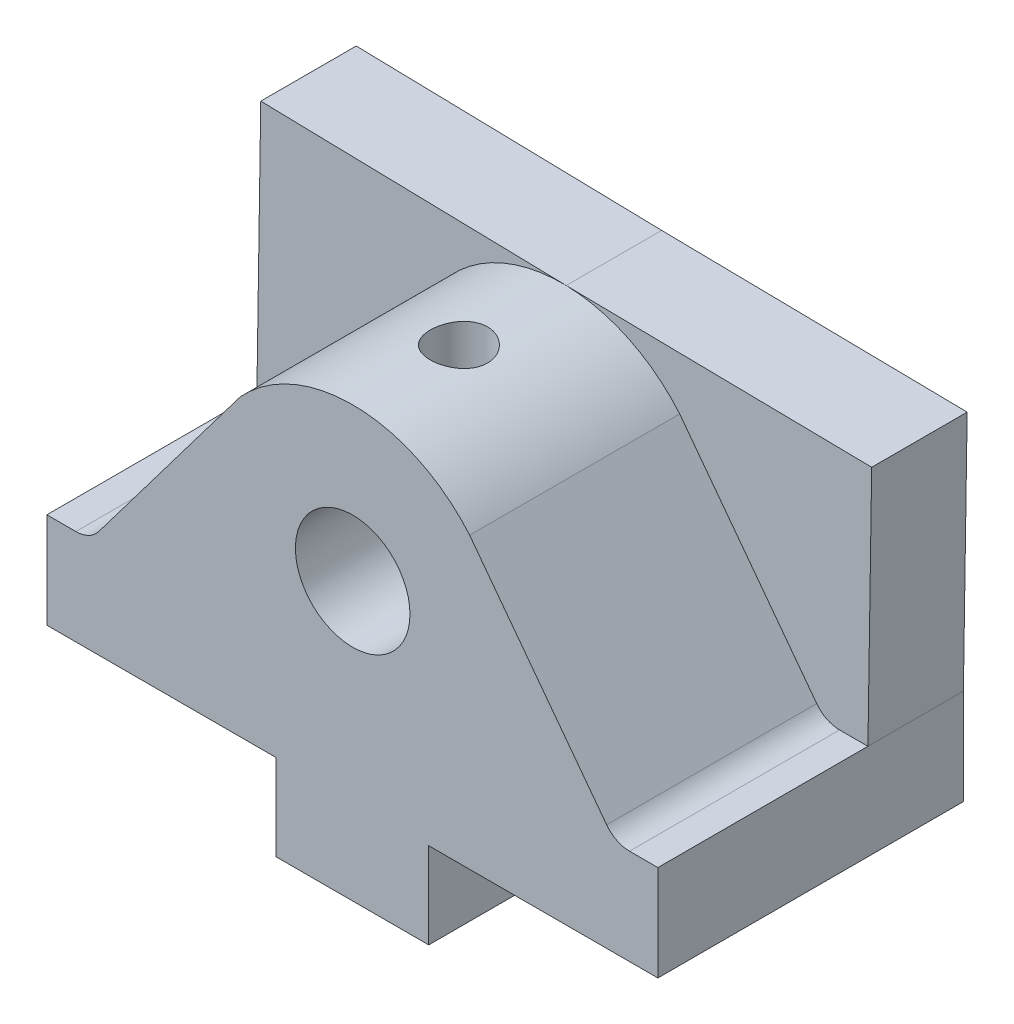
ISO-10303-21;
HEADER;
FILE_DESCRIPTION(('STEP AP214'),'2;1');
FILE_NAME('part.step','',(''),(''),'','','');
FILE_SCHEMA(('AUTOMOTIVE_DESIGN { 1 0 10303 214 1 1 1 1 }'));
ENDSEC;
DATA;
#1=APPLICATION_CONTEXT('core data for automotive mechanical design processes');
#2=APPLICATION_PROTOCOL_DEFINITION('international standard','automotive_design',2000,#1);
#3=PRODUCT_CONTEXT('',#1,'mechanical');
#4=PRODUCT('Part','Part','',(#3));
#5=PRODUCT_RELATED_PRODUCT_CATEGORY('part','',(#4));
#6=PRODUCT_DEFINITION_FORMATION('','',#4);
#7=PRODUCT_DEFINITION_CONTEXT('part definition',#1,'design');
#8=PRODUCT_DEFINITION('design','',#6,#7);
#9=PRODUCT_DEFINITION_SHAPE('','',#8);
#10=(LENGTH_UNIT() NAMED_UNIT(*) SI_UNIT(.MILLI.,.METRE.));
#11=(NAMED_UNIT(*) PLANE_ANGLE_UNIT() SI_UNIT($,.RADIAN.));
#12=(NAMED_UNIT(*) SI_UNIT($,.STERADIAN.) SOLID_ANGLE_UNIT());
#13=UNCERTAINTY_MEASURE_WITH_UNIT(LENGTH_MEASURE(1.E-05),#10,'distance_accuracy_value','');
#14=(GEOMETRIC_REPRESENTATION_CONTEXT(3) GLOBAL_UNCERTAINTY_ASSIGNED_CONTEXT((#13)) GLOBAL_UNIT_ASSIGNED_CONTEXT((#10,
#11,#12)) REPRESENTATION_CONTEXT('',''));
#15=CARTESIAN_POINT('',(0.,0.,0.));
#16=DIRECTION('',(0.,0.,1.));
#17=DIRECTION('',(1.,0.,0.));
#18=AXIS2_PLACEMENT_3D('',#15,#16,#17);
#19=CARTESIAN_POINT('',(0.,0.,-22.));
#20=DIRECTION('',(0.,0.,1.));
#21=DIRECTION('',(1.,0.,0.));
#22=AXIS2_PLACEMENT_3D('',#19,#20,#21);
#23=CYLINDRICAL_SURFACE('',#22,16.);
#24=CARTESIAN_POINT('',(0.,0.,0.));
#25=DIRECTION('',(0.,0.,1.));
#26=DIRECTION('',(1.,0.,0.));
#27=AXIS2_PLACEMENT_3D('',#24,#25,#26);
#28=CIRCLE('',#27,16.);
#29=CARTESIAN_POINT('',(12.2505989064215,10.2918815788943,0.));
#30=VERTEX_POINT('',#29);
#31=CARTESIAN_POINT('',(-11.7685318517286,10.8398181744368,0.));
#32=VERTEX_POINT('',#31);
#33=EDGE_CURVE('E110',#30,#32,#28,.T.);
#34=ORIENTED_EDGE('',*,*,#33,.F.);
#35=DIRECTION('',(0.,0.,1.));
#36=VECTOR('',#35,1.);
#37=CARTESIAN_POINT('',(12.2505989064215,10.2918815788943,-22.));
#38=LINE('',#37,#36);
#39=CARTESIAN_POINT('',(12.2505989064215,10.2918815788943,-22.));
#40=VERTEX_POINT('',#39);
#41=EDGE_CURVE('E118',#40,#30,#38,.T.);
#42=ORIENTED_EDGE('',*,*,#41,.F.);
#43=CARTESIAN_POINT('',(0.,0.,-22.));
#44=DIRECTION('',(0.,0.,1.));
#45=DIRECTION('',(1.,0.,0.));
#46=AXIS2_PLACEMENT_3D('',#43,#44,#45);
#47=CIRCLE('',#46,16.);
#48=CARTESIAN_POINT('',(0.364905178763938,15.9958383403469,-22.));
#49=VERTEX_POINT('',#48);
#50=EDGE_CURVE('E171',#40,#49,#47,.T.);
#51=ORIENTED_EDGE('',*,*,#50,.T.);
#52=CARTESIAN_POINT('',(-11.7685318517286,10.8398181744368,-22.));
#53=VERTEX_POINT('',#52);
#54=EDGE_CURVE('E115',#49,#53,#47,.T.);
#55=ORIENTED_EDGE('',*,*,#54,.T.);
#56=DIRECTION('',(0.,0.,1.));
#57=VECTOR('',#56,1.);
#58=CARTESIAN_POINT('',(-11.7685318517286,10.8398181744368,-22.));
#59=LINE('',#58,#57);
#60=EDGE_CURVE('E50',#53,#32,#59,.T.);
#61=ORIENTED_EDGE('',*,*,#60,.T.);
#62=EDGE_LOOP('',(#34,#42,#51,#55,#61));
#63=FACE_BOUND('',#62,.T.);
#64=CARTESIAN_POINT('',(0.,16.,-14.1252231760707));
#65=CARTESIAN_POINT('',(0.166943492930942,15.999996976677,-14.1252167968941));
#66=CARTESIAN_POINT('',(0.333969985460197,15.9973601984343,-14.1112410228319));
#67=CARTESIAN_POINT('',(0.663316259683595,15.9870957178104,-14.055743185834));
#68=CARTESIAN_POINT('',(0.825631948304451,15.9794638033379,-14.0141978747912));
#69=CARTESIAN_POINT('',(1.1407459237036,15.9600627753092,-13.904877773552));
#70=CARTESIAN_POINT('',(1.29355266137069,15.9482973989297,-13.8371266711656));
#71=CARTESIAN_POINT('',(1.58561594618801,15.9219142119957,-13.677385422225));
#72=CARTESIAN_POINT('',(1.72487358895464,15.9072966323658,-13.585397237781));
#73=CARTESIAN_POINT('',(1.987567431861,15.8766267286101,-13.3786236400633));
#74=CARTESIAN_POINT('',(2.11081791006366,15.860560697127,-13.2636042867304));
#75=CARTESIAN_POINT('',(2.33639212270738,15.828906369173,-13.0145365578956));
#76=CARTESIAN_POINT('',(2.43871435378483,15.8133181070905,-12.8804868165321));
#77=CARTESIAN_POINT('',(2.62029997331586,15.7842510249001,-12.5958509993427));
#78=CARTESIAN_POINT('',(2.6993744393921,15.7707898777236,-12.4451424354362));
#79=CARTESIAN_POINT('',(2.83101048664566,15.7476942642397,-12.1322853457171));
#80=CARTESIAN_POINT('',(2.88357435426196,15.7380594679392,-11.9701378078482));
#81=CARTESIAN_POINT('',(2.96010107007,15.723845391491,-11.6409927142419));
#82=CARTESIAN_POINT('',(2.98438780384078,15.7192089073281,-11.4740729816638));
#83=CARTESIAN_POINT('',(3.00467616190693,15.7153439430552,-11.1384684064542));
#84=CARTESIAN_POINT('',(3.00068032270748,15.7161149779752,-10.9697837234661));
#85=CARTESIAN_POINT('',(2.96477959204725,15.7229258540351,-10.6377841255386));
#86=CARTESIAN_POINT('',(2.9332429999209,15.7288961629467,-10.4744277474704));
#87=CARTESIAN_POINT('',(2.84373598792414,15.7453236656933,-10.1553663365055));
#88=CARTESIAN_POINT('',(2.78576444478999,15.7557810501903,-9.99966162905208));
#89=CARTESIAN_POINT('',(2.644672943586,15.7800771058518,-9.69924581807015));
#90=CARTESIAN_POINT('',(2.56140427064912,15.7939356764673,-9.55460623490906));
#91=CARTESIAN_POINT('',(2.37218737860832,15.8234594320584,-9.28121371899021));
#92=CARTESIAN_POINT('',(2.26623685778532,15.8391248003104,-9.15246240064108));
#93=CARTESIAN_POINT('',(2.03267811370595,15.8708000254433,-8.91237326472576));
#94=CARTESIAN_POINT('',(1.90475487372136,15.8868114204806,-8.80134187116719));
#95=CARTESIAN_POINT('',(1.63193607419765,15.9171477221664,-8.60226869471987));
#96=CARTESIAN_POINT('',(1.48704034451154,15.9314726119049,-8.51422714232984));
#97=CARTESIAN_POINT('',(1.18406997774934,15.9568507935502,-8.36358766833064));
#98=CARTESIAN_POINT('',(1.02597912889299,15.9678999827258,-8.30102161783489));
#99=CARTESIAN_POINT('',(0.701278230797394,15.9854501080544,-8.20341898988636));
#100=CARTESIAN_POINT('',(0.534669088555574,15.9919515273599,-8.16837948797997));
#101=CARTESIAN_POINT('',(0.20029730580677,15.9996072128396,-8.12725111403414));
#102=CARTESIAN_POINT('',(0.03258802526827,16.0008390182456,-8.12074239301123));
#103=CARTESIAN_POINT('',(-0.301522496184368,15.9980308719646,-8.13573413516598));
#104=CARTESIAN_POINT('',(-0.467923800960771,15.9939911792886,-8.1572332222012));
#105=CARTESIAN_POINT('',(-0.793363146436434,15.9811422300081,-8.22728124643741));
#106=CARTESIAN_POINT('',(-0.952448522092127,15.9723704474806,-8.27561774114631));
#107=CARTESIAN_POINT('',(-1.26025726364927,15.95103684425,-8.39773858962825));
#108=CARTESIAN_POINT('',(-1.40897992519021,15.9384747662267,-8.47152467120225));
#109=CARTESIAN_POINT('',(-1.69363334302643,15.9107606071533,-8.6433794323897));
#110=CARTESIAN_POINT('',(-1.82940655403024,15.8955817234913,-8.74170465314436));
#111=CARTESIAN_POINT('',(-2.08267664652909,15.8643868697942,-8.9594994507954));
#112=CARTESIAN_POINT('',(-2.20017181952173,15.8483708216937,-9.07897100207334));
#113=CARTESIAN_POINT('',(-2.41514591744096,15.817049513949,-9.33756781389353));
#114=CARTESIAN_POINT('',(-2.51233832437153,15.8017565172051,-9.47693299232145));
#115=CARTESIAN_POINT('',(-2.68193350115574,15.7738597115706,-9.77025842511818));
#116=CARTESIAN_POINT('',(-2.75433719227848,15.761255802747,-9.92421813681163));
#117=CARTESIAN_POINT('',(-2.87189347025646,15.7402604841915,-10.2416349105558));
#118=CARTESIAN_POINT('',(-2.91717737589572,15.7318488087376,-10.4050419351893));
#119=CARTESIAN_POINT('',(-2.97961358652471,15.7201440760483,-10.7373176211135));
#120=CARTESIAN_POINT('',(-2.99676906541416,15.7168504413158,-10.9061856640115));
#121=CARTESIAN_POINT('',(-3.00235524296709,15.7157839960771,-11.2417198389537));
#122=CARTESIAN_POINT('',(-2.99123790006998,15.7179243194859,-11.4083783379847));
#123=CARTESIAN_POINT('',(-2.94158350757606,15.7272920132,-11.7374060201613));
#124=CARTESIAN_POINT('',(-2.90304662178664,15.7345193531149,-11.8997752289256));
#125=CARTESIAN_POINT('',(-2.79983775166526,15.7532101604636,-12.2153721456616));
#126=CARTESIAN_POINT('',(-2.73521470794505,15.7646656918993,-12.3686163587622));
#127=CARTESIAN_POINT('',(-2.58171737824408,15.7905277510368,-12.6621596845524));
#128=CARTESIAN_POINT('',(-2.49284137896371,15.8049344872024,-12.8024578817602));
#129=CARTESIAN_POINT('',(-2.2917897467907,15.8353453221549,-13.0683905361553));
#130=CARTESIAN_POINT('',(-2.17928519728607,15.8513701070609,-13.1937740012049));
#131=CARTESIAN_POINT('',(-1.93485585348458,15.8830566783747,-13.4240335009997));
#132=CARTESIAN_POINT('',(-1.80292660378323,15.8987183805466,-13.528904818031));
#133=CARTESIAN_POINT('',(-1.52196989014374,15.928079519361,-13.7160450813248));
#134=CARTESIAN_POINT('',(-1.37279918128103,15.9417600198112,-13.798102033052));
#135=CARTESIAN_POINT('',(-1.06258022730767,15.9654323876137,-13.9358584492809));
#136=CARTESIAN_POINT('',(-0.901543303410496,15.9754277175807,-13.9915826701645));
#137=CARTESIAN_POINT('',(-0.616694405650308,15.9885658141526,-14.063777804908));
#138=CARTESIAN_POINT('',(-0.494547620503741,15.9928294175641,-14.0867804366963));
#139=CARTESIAN_POINT('',(-0.248282494230315,15.9985475990802,-14.1175053003036));
#140=CARTESIAN_POINT('',(-0.124164203305419,16.0000022485961,-14.1252279205825));
#141=CARTESIAN_POINT('',(0.,16.,-14.1252231760707));
#142=B_SPLINE_CURVE_WITH_KNOTS('',3,(#64,#65,#66,#67,#68,#69,#70,#71,#72,#73,#74,#75,#76,#77,
#78,#79,#80,#81,#82,#83,#84,#85,#86,#87,#88,#89,#90,#91,#92,#93,#94,#95,#96,#97,#98,#99,#100,
#101,#102,#103,#104,#105,#106,#107,#108,#109,#110,#111,#112,#113,#114,#115,#116,#117,#118,#119,
#120,#121,#122,#123,#124,#125,#126,#127,#128,#129,#130,#131,#132,#133,#134,#135,#136,#137,#138,
#139,#140,#141),.UNSPECIFIED.,.T.,.F.,(4,2,2,2,2,2,2,2,2,2,2,2,2,2,2,2,2,2,2,2,2,2,2,2,2,2,2,2,
2,2,2,2,2,2,2,2,2,2,4),(0.,0.500376401929848,1.0011752850709,1.50152254246181,2.00182930673781,
2.50750236027261,3.01321172567233,3.52292381008715,4.03259192623897,4.53636302890671,
5.04008895174512,5.53718001225531,6.03429219693573,6.53438525259061,7.03452908099719,
7.54255536928154,8.05058675089895,8.55925176643397,9.06786273347491,9.56896348152193,
10.0700396092917,10.5672046781566,11.0644035067606,11.5670355603542,12.069714568262,
12.579068739746,13.0884039790989,13.5952525563712,14.1020439389302,14.600785044635,
15.0995231708301,15.5973299241538,16.0951718531085,16.6004673993276,17.1058790252451,
17.6158409783263,18.1253225386235,18.4974868904882,18.8696417807908),.UNSPECIFIED.);
#143=CARTESIAN_POINT('',(0.,16.,-14.1252231760707));
#144=VERTEX_POINT('',#143);
#145=EDGE_CURVE('E180',#144,#144,#142,.T.);
#146=ORIENTED_EDGE('',*,*,#145,.T.);
#147=EDGE_LOOP('',(#146));
#148=FACE_BOUND('',#147,.T.);
#149=ADVANCED_FACE('F35',(#63,#148),#23,.T.);
#150=CARTESIAN_POINT('',(0.,0.,-22.));
#151=DIRECTION('',(0.,0.,1.));
#152=DIRECTION('',(1.,0.,0.));
#153=AXIS2_PLACEMENT_3D('',#150,#151,#152);
#154=CYLINDRICAL_SURFACE('',#153,6.);
#155=CARTESIAN_POINT('',(0.,0.,0.));
#156=DIRECTION('',(0.,0.,1.));
#157=DIRECTION('',(1.,0.,0.));
#158=AXIS2_PLACEMENT_3D('',#155,#156,#157);
#159=CIRCLE('',#158,6.);
#160=CARTESIAN_POINT('',(6.,0.,0.));
#161=VERTEX_POINT('',#160);
#162=EDGE_CURVE('E126',#161,#161,#159,.T.);
#163=ORIENTED_EDGE('',*,*,#162,.T.);
#164=EDGE_LOOP('',(#163));
#165=FACE_BOUND('',#164,.T.);
#166=CARTESIAN_POINT('',(0.,6.,-14.1252231760707));
#167=CARTESIAN_POINT('',(0.0788941476270899,5.99999934964153,-14.1252223373302));
#168=CARTESIAN_POINT('',(0.15779662040795,5.99843869002385,-14.1221052305951));
#169=CARTESIAN_POINT('',(0.315001991255922,5.99224358793258,-14.1096839043307));
#170=CARTESIAN_POINT('',(0.393304603620535,5.98760776295702,-14.1003769020052));
#171=CARTESIAN_POINT('',(0.626628691373742,5.96921978027472,-14.063265319252));
#172=CARTESIAN_POINT('',(0.779952894844981,5.95098734455496,-14.026270347008));
#173=CARTESIAN_POINT('',(1.07683586335997,5.90448966743082,-13.9296414016414));
#174=CARTESIAN_POINT('',(1.22043005484385,5.87626344365678,-13.8700954098623));
#175=CARTESIAN_POINT('',(1.49540820515375,5.81237302716333,-13.7305119253918));
#176=CARTESIAN_POINT('',(1.62679312559149,5.77670942093694,-13.6504760483674));
#177=CARTESIAN_POINT('',(1.88252701271777,5.69868752298931,-13.4666691952212));
#178=CARTESIAN_POINT('',(2.0059694541685,5.65605474586613,-13.3617552285493));
#179=CARTESIAN_POINT('',(2.23433451090185,5.56980033629331,-13.1336672545841));
#180=CARTESIAN_POINT('',(2.33924301355731,5.5261779786051,-13.0104794629054));
#181=CARTESIAN_POINT('',(2.53576864722249,5.43896347969577,-12.7377388159889));
#182=CARTESIAN_POINT('',(2.62572411176601,5.39563602686729,-12.5868822016125));
#183=CARTESIAN_POINT('',(2.7403403145029,5.33782449719394,-12.3492723220475));
#184=CARTESIAN_POINT('',(2.77516786882117,5.31974570840245,-12.2681522515079));
#185=CARTESIAN_POINT('',(2.83769299596485,5.28665768365286,-12.1026225961902));
#186=CARTESIAN_POINT('',(2.86539478083936,5.27164663543394,-12.018214988813));
#187=CARTESIAN_POINT('',(2.91188280266506,5.24610341708083,-11.8518273793084));
#188=CARTESIAN_POINT('',(2.93110042292907,5.23535838565202,-11.7700003793142));
#189=CARTESIAN_POINT('',(2.9626355938468,5.21757784151145,-11.6046682675511));
#190=CARTESIAN_POINT('',(2.97495680535109,5.21054036082126,-11.52116407053));
#191=CARTESIAN_POINT('',(2.99251382412705,5.20047756645272,-11.3532168086544));
#192=CARTESIAN_POINT('',(2.99775389857938,5.19744983647106,-11.268774340177));
#193=CARTESIAN_POINT('',(3.00108452416055,5.19552555967191,-11.0997295217292));
#194=CARTESIAN_POINT('',(2.9991757574161,5.19662861870362,-11.0151271877828));
#195=CARTESIAN_POINT('',(2.98404973540404,5.20534668059274,-10.7824692777484));
#196=CARTESIAN_POINT('',(2.96335042632723,5.21726794353739,-10.6349790219163));
#197=CARTESIAN_POINT('',(2.90082280036694,5.25228182412118,-10.3460294992456));
#198=CARTESIAN_POINT('',(2.85898775295595,5.2753780002338,-10.20457216912));
#199=CARTESIAN_POINT('',(2.75462843937304,5.33062568888727,-9.92754352577385));
#200=CARTESIAN_POINT('',(2.69164495870316,5.36297559567996,-9.79218606431954));
#201=CARTESIAN_POINT('',(2.54712530575799,5.43310175251306,-9.53331821275665));
#202=CARTESIAN_POINT('',(2.46558080007524,5.47088043711311,-9.4098131795902));
#203=CARTESIAN_POINT('',(2.27419808739747,5.55339485686876,-9.16166008229087));
#204=CARTESIAN_POINT('',(2.16208335434885,5.59840533924979,-9.03885273368658));
#205=CARTESIAN_POINT('',(1.91866675699301,5.68642866684949,-8.81301674186862));
#206=CARTESIAN_POINT('',(1.78735577540359,5.72944054996685,-8.70999755116482));
#207=CARTESIAN_POINT('',(1.50154951155102,5.81105962769461,-8.52216624405205));
#208=CARTESIAN_POINT('',(1.3462607732106,5.84936952731879,-8.43842177237309));
#209=CARTESIAN_POINT('',(1.02139864805275,5.91473643118065,-8.29893207531287));
#210=CARTESIAN_POINT('',(0.851836729203681,5.94180236767508,-8.24316461752103));
#211=CARTESIAN_POINT('',(0.518299474608031,5.97973001282228,-8.16579696813457));
#212=CARTESIAN_POINT('',(0.355024591545112,5.99174814919366,-8.14174946968894));
#213=CARTESIAN_POINT('',(0.0263387999478714,6.00219040361882,-8.12082898180902));
#214=CARTESIAN_POINT('',(-0.13907105958427,6.00062096160122,-8.12394311893116));
#215=CARTESIAN_POINT('',(-0.453698915981445,5.98473576763841,-8.15584324153089));
#216=CARTESIAN_POINT('',(-0.60317822415514,5.97141737064974,-8.18262077431462));
#217=CARTESIAN_POINT('',(-0.895220676900474,5.93466513944051,-8.25793739170208));
#218=CARTESIAN_POINT('',(-1.03778305707535,5.91123019004896,-8.30647887541929));
#219=CARTESIAN_POINT('',(-1.31666582534657,5.85552754239055,-8.42521857538198));
#220=CARTESIAN_POINT('',(-1.45269119100304,5.82302645301465,-8.49599632641196));
#221=CARTESIAN_POINT('',(-1.71138408511219,5.75231922959683,-8.65654578301796));
#222=CARTESIAN_POINT('',(-1.83404588938514,5.71411066728831,-8.74632557989941));
#223=CARTESIAN_POINT('',(-2.07530306780484,5.63124663977895,-8.9525044520144));
#224=CARTESIAN_POINT('',(-2.19231623321556,5.58632654410486,-9.07065178121547));
#225=CARTESIAN_POINT('',(-2.40556896301298,5.49787174706805,-9.32499862975548));
#226=CARTESIAN_POINT('',(-2.50179415686851,5.4543380217028,-9.46121053265109));
#227=CARTESIAN_POINT('',(-2.675123743717,5.37153576650779,-9.75615413855101));
#228=CARTESIAN_POINT('',(-2.75107648817021,5.33257588763925,-9.91565697403325));
#229=CARTESIAN_POINT('',(-2.87424847703564,5.26722216885657,-10.247753379116));
#230=CARTESIAN_POINT('',(-2.92150474480837,5.24081214709482,-10.4203297567139));
#231=CARTESIAN_POINT('',(-2.98158506492521,5.2068450303742,-10.7559538436015));
#232=CARTESIAN_POINT('',(-2.997278998202,5.19772150245585,-10.918325932361));
#233=CARTESIAN_POINT('',(-3.00206745414685,5.19496064074354,-11.243564381578));
#234=CARTESIAN_POINT('',(-2.99117350647291,5.20131659437267,-11.4064304972133));
#235=CARTESIAN_POINT('',(-2.94577840699521,5.22713585648299,-11.7116736671641));
#236=CARTESIAN_POINT('',(-2.91362505078136,5.24529281646867,-11.8545245383363));
#237=CARTESIAN_POINT('',(-2.82952596688629,5.29113050364645,-12.1326475825279));
#238=CARTESIAN_POINT('',(-2.77757387249734,5.3188142941166,-12.2679173015986));
#239=CARTESIAN_POINT('',(-2.65144766382427,5.38285583940632,-12.5370975377353));
#240=CARTESIAN_POINT('',(-2.57601505988081,5.41967139666624,-12.6703061455496));
#241=CARTESIAN_POINT('',(-2.40645126762009,5.49706022440067,-12.9230475210064));
#242=CARTESIAN_POINT('',(-2.31231035120759,5.53763544397051,-13.0425731224751));
#243=CARTESIAN_POINT('',(-2.09461689129199,5.62386853947507,-13.2796460335587));
#244=CARTESIAN_POINT('',(-1.96888052183388,5.66954494371953,-13.3951883002321));
#245=CARTESIAN_POINT('',(-1.69843715077041,5.75633712356327,-13.6040243161416));
#246=CARTESIAN_POINT('',(-1.55371998850183,5.79745043456127,-13.6973060730929));
#247=CARTESIAN_POINT('',(-1.32452333533412,5.85251406841986,-13.8184013606273));
#248=CARTESIAN_POINT('',(-1.24575314775787,5.86982524242744,-13.8557433763123));
#249=CARTESIAN_POINT('',(-1.08479725492719,5.90168845962536,-13.9235848548945));
#250=CARTESIAN_POINT('',(-1.00261324805381,5.91624185523758,-13.9540876731042));
#251=CARTESIAN_POINT('',(-0.835616997915663,5.94212690185115,-14.0078304320632));
#252=CARTESIAN_POINT('',(-0.750810940130685,5.95346557615479,-14.0310862168347));
#253=CARTESIAN_POINT('',(-0.579142357408353,5.97260771878739,-14.0701057488513));
#254=CARTESIAN_POINT('',(-0.492281122825508,5.98041334646939,-14.0858740726271));
#255=CARTESIAN_POINT('',(-0.337824895315461,5.99085829855372,-14.1069078546842));
#256=CARTESIAN_POINT('',(-0.270495162095328,5.99428035414515,-14.1137700937966));
#257=CARTESIAN_POINT('',(-0.135445671381779,5.99885151538357,-14.1229281775137));
#258=CARTESIAN_POINT('',(-0.0677259031748618,6.00000055829381,-14.1252238960792));
#259=CARTESIAN_POINT('',(0.,6.,-14.1252231760707));
#260=B_SPLINE_CURVE_WITH_KNOTS('',3,(#166,#167,#168,#169,#170,#171,#172,#173,#174,#175,#176,
#177,#178,#179,#180,#181,#182,#183,#184,#185,#186,#187,#188,#189,#190,#191,#192,#193,#194,#195,
#196,#197,#198,#199,#200,#201,#202,#203,#204,#205,#206,#207,#208,#209,#210,#211,#212,#213,#214,
#215,#216,#217,#218,#219,#220,#221,#222,#223,#224,#225,#226,#227,#228,#229,#230,#231,#232,#233,
#234,#235,#236,#237,#238,#239,#240,#241,#242,#243,#244,#245,#246,#247,#248,#249,#250,#251,#252,
#253,#254,#255,#256,#257,#258,#259),.UNSPECIFIED.,.T.,.F.,(4,2,2,2,2,2,2,2,2,2,2,2,2,2,2,2,2,2,
2,2,2,2,2,2,2,2,2,2,2,2,2,2,2,2,2,2,2,2,2,2,2,2,2,2,2,2,4),(0.,0.236611432443576,
0.4733293104377,0.947100987304415,1.41904300465372,1.89094781992153,2.39140181433109,
2.89223525113893,3.4319083310994,3.70192714967837,3.97178599119154,4.22563720033309,
4.47935352842581,4.73291689564224,4.98645606901568,5.43238672147391,5.87845946700878,
6.33492255429304,6.79159098704508,7.30616358925478,7.82098138719902,8.35970601567165,
8.89800185660681,9.3917140633788,9.88519228458271,10.3404225444221,10.7957029981664,
11.2640010300754,11.7324988716886,12.2470036685628,12.7618630076938,13.3016558140826,
13.8407507075944,14.3280945743222,14.8152271451712,15.2559532566965,15.6968212128814,
16.1673090526395,16.6380421835398,17.1659726319345,17.6941868506379,17.9605054214138,
18.2266930489272,18.4922945660822,18.7577335310501,18.9608446764332,19.1639614277476),.UNSPECIFIED.);
#261=CARTESIAN_POINT('',(0.,6.,-14.1252231760707));
#262=VERTEX_POINT('',#261);
#263=EDGE_CURVE('E39',#262,#262,#260,.T.);
#264=ORIENTED_EDGE('',*,*,#263,.F.);
#265=EDGE_LOOP('',(#264));
#266=FACE_BOUND('',#265,.T.);
#267=CARTESIAN_POINT('',(0.,0.,-32.));
#268=DIRECTION('',(0.,0.,-1.));
#269=DIRECTION('',(-1.,0.,0.));
#270=AXIS2_PLACEMENT_3D('',#267,#268,#269);
#271=CIRCLE('',#270,6.);
#272=CARTESIAN_POINT('',(-6.,0.,-32.));
#273=VERTEX_POINT('',#272);
#274=EDGE_CURVE('E524',#273,#273,#271,.F.);
#275=ORIENTED_EDGE('',*,*,#274,.F.);
#276=EDGE_LOOP('',(#275));
#277=FACE_BOUND('',#276,.T.);
#278=ADVANCED_FACE('F286',(#165,#266,#277),#154,.F.);
#279=CARTESIAN_POINT('',(-28.9941676139963,-7.,-22.));
#280=DIRECTION('',(0.,0.,1.));
#281=DIRECTION('',(1.,0.,0.));
#282=AXIS2_PLACEMENT_3D('',#279,#280,#281);
#283=CYLINDRICAL_SURFACE('',#282,3.);
#284=CARTESIAN_POINT('',(-28.9941676139963,-7.,0.));
#285=DIRECTION('',(0.,0.,1.));
#286=DIRECTION('',(1.,0.,0.));
#287=AXIS2_PLACEMENT_3D('',#284,#285,#286);
#288=CIRCLE('',#287,3.);
#289=CARTESIAN_POINT('',(-28.9941676139963,-10.,0.));
#290=VERTEX_POINT('',#289);
#291=CARTESIAN_POINT('',(-26.5997826776081,-8.80746252420267,0.));
#292=VERTEX_POINT('',#291);
#293=EDGE_CURVE('E177',#290,#292,#288,.T.);
#294=ORIENTED_EDGE('',*,*,#293,.T.);
#295=DIRECTION('',(0.,0.,1.));
#296=VECTOR('',#295,1.);
#297=CARTESIAN_POINT('',(-26.5997826776081,-8.80746252420267,-22.));
#298=LINE('',#297,#296);
#299=CARTESIAN_POINT('',(-26.5997826776081,-8.80746252420267,-22.));
#300=VERTEX_POINT('',#299);
#301=EDGE_CURVE('E11',#300,#292,#298,.T.);
#302=ORIENTED_EDGE('',*,*,#301,.F.);
#303=CARTESIAN_POINT('',(-28.9941676139963,-7.,-22.));
#304=DIRECTION('',(0.,0.,1.));
#305=DIRECTION('',(1.,0.,0.));
#306=AXIS2_PLACEMENT_3D('',#303,#304,#305);
#307=CIRCLE('',#306,3.);
#308=CARTESIAN_POINT('',(-28.9941676139963,-10.,-22.));
#309=VERTEX_POINT('',#308);
#310=EDGE_CURVE('E139',#309,#300,#307,.T.);
#311=ORIENTED_EDGE('',*,*,#310,.F.);
#312=DIRECTION('',(0.,0.,1.));
#313=VECTOR('',#312,1.);
#314=CARTESIAN_POINT('',(-28.9941676139963,-10.,-22.));
#315=LINE('',#314,#313);
#316=EDGE_CURVE('E165',#309,#290,#315,.T.);
#317=ORIENTED_EDGE('',*,*,#316,.T.);
#318=EDGE_LOOP('',(#294,#302,#311,#317));
#319=FACE_BOUND('',#318,.T.);
#320=ADVANCED_FACE('F37',(#319),#283,.F.);
#321=CARTESIAN_POINT('',(-12.7091186931897,9.59380231828337,-22.));
#322=DIRECTION('',(0.798128312129411,-0.60248750806756,0.));
#323=DIRECTION('',(0.60248750806756,0.798128312129411,0.));
#324=AXIS2_PLACEMENT_3D('',#321,#322,#323);
#325=PLANE('',#324);
#326=DIRECTION('',(0.60248750806756,0.798128312129411,0.));
#327=VECTOR('',#326,1.);
#328=CARTESIAN_POINT('',(-12.7091186931897,9.59380231828337,0.));
#329=LINE('',#328,#327);
#330=EDGE_CURVE('E120',#292,#32,#329,.T.);
#331=ORIENTED_EDGE('',*,*,#330,.T.);
#332=ORIENTED_EDGE('',*,*,#60,.F.);
#333=DIRECTION('',(0.60248750806756,0.798128312129411,0.));
#334=VECTOR('',#333,1.);
#335=CARTESIAN_POINT('',(-12.7091186931897,9.59380231828337,-22.));
#336=LINE('',#335,#334);
#337=EDGE_CURVE('E166',#300,#53,#336,.T.);
#338=ORIENTED_EDGE('',*,*,#337,.F.);
#339=ORIENTED_EDGE('',*,*,#301,.T.);
#340=EDGE_LOOP('',(#331,#332,#338,#339));
#341=FACE_BOUND('',#340,.T.);
#342=ADVANCED_FACE('F121',(#341),#325,.F.);
#343=CARTESIAN_POINT('',(12.7719420479448,9.59814723320809,-22.));
#344=DIRECTION('',(0.79942306105141,0.600768482411647,0.));
#345=DIRECTION('',(-0.600768482411647,0.79942306105141,0.));
#346=AXIS2_PLACEMENT_3D('',#343,#344,#345);
#347=PLANE('',#346);
#348=DIRECTION('',(-0.600768482411647,0.79942306105141,0.));
#349=VECTOR('',#348,1.);
#350=CARTESIAN_POINT('',(12.7719420479448,9.59814723320809,0.));
#351=LINE('',#350,#349);
#352=CARTESIAN_POINT('',(26.5999294692462,-8.80230544723495,0.));
#353=VERTEX_POINT('',#352);
#354=EDGE_CURVE('E132',#353,#30,#351,.T.);
#355=ORIENTED_EDGE('',*,*,#354,.F.);
#356=DIRECTION('',(0.,0.,1.));
#357=VECTOR('',#356,1.);
#358=CARTESIAN_POINT('',(26.5999294692462,-8.80230544723495,-22.));
#359=LINE('',#358,#357);
#360=CARTESIAN_POINT('',(26.5999294692462,-8.80230544723495,-22.));
#361=VERTEX_POINT('',#360);
#362=EDGE_CURVE('E142',#361,#353,#359,.T.);
#363=ORIENTED_EDGE('',*,*,#362,.F.);
#364=DIRECTION('',(-0.600768482411647,0.79942306105141,0.));
#365=VECTOR('',#364,1.);
#366=CARTESIAN_POINT('',(12.7719420479448,9.59814723320809,-22.));
#367=LINE('',#366,#365);
#368=EDGE_CURVE('E255',#361,#40,#367,.T.);
#369=ORIENTED_EDGE('',*,*,#368,.T.);
#370=ORIENTED_EDGE('',*,*,#41,.T.);
#371=EDGE_LOOP('',(#355,#363,#369,#370));
#372=FACE_BOUND('',#371,.T.);
#373=ADVANCED_FACE('F291',(#372),#347,.T.);
#374=CARTESIAN_POINT('',(28.9981986524004,-7.00000000000002,-22.));
#375=DIRECTION('',(0.,0.,1.));
#376=DIRECTION('',(1.,0.,0.));
#377=AXIS2_PLACEMENT_3D('',#374,#375,#376);
#378=CYLINDRICAL_SURFACE('',#377,3.);
#379=CARTESIAN_POINT('',(28.9981986524004,-7.00000000000002,0.));
#380=DIRECTION('',(0.,0.,1.));
#381=DIRECTION('',(1.,0.,0.));
#382=AXIS2_PLACEMENT_3D('',#379,#380,#381);
#383=CIRCLE('',#382,3.);
#384=CARTESIAN_POINT('',(28.9981986524004,-10.,0.));
#385=VERTEX_POINT('',#384);
#386=EDGE_CURVE('E134',#353,#385,#383,.T.);
#387=ORIENTED_EDGE('',*,*,#386,.T.);
#388=DIRECTION('',(0.,0.,1.));
#389=VECTOR('',#388,1.);
#390=CARTESIAN_POINT('',(28.9981986524004,-10.,-22.));
#391=LINE('',#390,#389);
#392=CARTESIAN_POINT('',(28.9981986524004,-10.,-22.));
#393=VERTEX_POINT('',#392);
#394=EDGE_CURVE('E144',#393,#385,#391,.T.);
#395=ORIENTED_EDGE('',*,*,#394,.F.);
#396=CARTESIAN_POINT('',(28.9981986524004,-7.00000000000002,-22.));
#397=DIRECTION('',(0.,0.,1.));
#398=DIRECTION('',(1.,0.,0.));
#399=AXIS2_PLACEMENT_3D('',#396,#397,#398);
#400=CIRCLE('',#399,3.);
#401=EDGE_CURVE('E256',#361,#393,#400,.T.);
#402=ORIENTED_EDGE('',*,*,#401,.F.);
#403=ORIENTED_EDGE('',*,*,#362,.T.);
#404=EDGE_LOOP('',(#387,#395,#402,#403));
#405=FACE_BOUND('',#404,.T.);
#406=ADVANCED_FACE('F205',(#405),#378,.F.);
#407=CARTESIAN_POINT('',(0.,-10.,-22.));
#408=DIRECTION('',(0.,-1.,0.));
#409=DIRECTION('',(0.,0.,-1.));
#410=AXIS2_PLACEMENT_3D('',#407,#408,#409);
#411=PLANE('',#410);
#412=DIRECTION('',(1.,0.,0.));
#413=VECTOR('',#412,1.);
#414=CARTESIAN_POINT('',(0.,-10.,0.));
#415=LINE('',#414,#413);
#416=CARTESIAN_POINT('',(31.9670074391608,-10.,0.));
#417=VERTEX_POINT('',#416);
#418=EDGE_CURVE('E202',#385,#417,#415,.T.);
#419=ORIENTED_EDGE('',*,*,#418,.T.);
#420=DIRECTION('',(0.,0.,1.));
#421=VECTOR('',#420,1.);
#422=CARTESIAN_POINT('',(31.9670074391608,-10.,-22.));
#423=LINE('',#422,#421);
#424=CARTESIAN_POINT('',(31.9670074391608,-10.,-22.));
#425=VERTEX_POINT('',#424);
#426=EDGE_CURVE('E147',#425,#417,#423,.T.);
#427=ORIENTED_EDGE('',*,*,#426,.F.);
#428=DIRECTION('',(1.,0.,0.));
#429=VECTOR('',#428,1.);
#430=CARTESIAN_POINT('',(0.,-10.,-22.));
#431=LINE('',#430,#429);
#432=EDGE_CURVE('E214',#393,#425,#431,.T.);
#433=ORIENTED_EDGE('',*,*,#432,.F.);
#434=ORIENTED_EDGE('',*,*,#394,.T.);
#435=EDGE_LOOP('',(#419,#427,#433,#434));
#436=FACE_BOUND('',#435,.T.);
#437=ADVANCED_FACE('F211',(#436),#411,.F.);
#438=CARTESIAN_POINT('',(31.9670074391608,0.,-22.));
#439=DIRECTION('',(-1.,0.,0.));
#440=DIRECTION('',(0.,0.,1.));
#441=AXIS2_PLACEMENT_3D('',#438,#439,#440);
#442=PLANE('',#441);
#443=DIRECTION('',(0.,-1.,0.));
#444=VECTOR('',#443,1.);
#445=CARTESIAN_POINT('',(31.9670074391608,0.,0.));
#446=LINE('',#445,#444);
#447=CARTESIAN_POINT('',(31.9670074391608,-20.0164962804196,0.));
#448=VERTEX_POINT('',#447);
#449=EDGE_CURVE('E199',#417,#448,#446,.T.);
#450=ORIENTED_EDGE('',*,*,#449,.T.);
#451=DIRECTION('',(0.,0.,1.));
#452=VECTOR('',#451,1.);
#453=CARTESIAN_POINT('',(31.9670074391608,-20.0164962804196,-22.));
#454=LINE('',#453,#452);
#455=CARTESIAN_POINT('',(31.9670074391608,-20.0164962804196,-32.));
#456=VERTEX_POINT('',#455);
#457=EDGE_CURVE('E150',#456,#448,#454,.T.);
#458=ORIENTED_EDGE('',*,*,#457,.F.);
#459=DIRECTION('',(0.,-1.,0.));
#460=VECTOR('',#459,1.);
#461=CARTESIAN_POINT('',(31.9670074391608,0.,-32.));
#462=LINE('',#461,#460);
#463=CARTESIAN_POINT('',(31.9670074391608,-10.,-32.));
#464=VERTEX_POINT('',#463);
#465=EDGE_CURVE('E494',#464,#456,#462,.T.);
#466=ORIENTED_EDGE('',*,*,#465,.F.);
#467=DIRECTION('',(0.,0.,1.));
#468=VECTOR('',#467,1.);
#469=CARTESIAN_POINT('',(31.9670074391608,-10.,-32.));
#470=LINE('',#469,#468);
#471=EDGE_CURVE('E226',#464,#425,#470,.T.);
#472=ORIENTED_EDGE('',*,*,#471,.T.);
#473=ORIENTED_EDGE('',*,*,#426,.T.);
#474=EDGE_LOOP('',(#450,#458,#466,#472,#473));
#475=FACE_BOUND('',#474,.T.);
#476=ADVANCED_FACE('F219',(#475),#442,.F.);
#477=CARTESIAN_POINT('',(0.,-20.0164962804196,-22.));
#478=DIRECTION('',(0.,-1.,0.));
#479=DIRECTION('',(0.,0.,-1.));
#480=AXIS2_PLACEMENT_3D('',#477,#478,#479);
#481=PLANE('',#480);
#482=DIRECTION('',(1.,0.,0.));
#483=VECTOR('',#482,1.);
#484=CARTESIAN_POINT('',(0.,-20.0164962804196,0.));
#485=LINE('',#484,#483);
#486=CARTESIAN_POINT('',(7.96700743916075,-20.0164962804196,0.));
#487=VERTEX_POINT('',#486);
#488=EDGE_CURVE('E196',#487,#448,#485,.T.);
#489=ORIENTED_EDGE('',*,*,#488,.F.);
#490=DIRECTION('',(0.,0.,1.));
#491=VECTOR('',#490,1.);
#492=CARTESIAN_POINT('',(7.96700743916075,-20.0164962804196,-22.));
#493=LINE('',#492,#491);
#494=CARTESIAN_POINT('',(7.96700743916075,-20.0164962804196,-32.));
#495=VERTEX_POINT('',#494);
#496=EDGE_CURVE('E152',#495,#487,#493,.T.);
#497=ORIENTED_EDGE('',*,*,#496,.F.);
#498=DIRECTION('',(-1.,0.,0.));
#499=VECTOR('',#498,1.);
#500=CARTESIAN_POINT('',(0.,-20.0164962804196,-32.));
#501=LINE('',#500,#499);
#502=EDGE_CURVE('E497',#456,#495,#501,.T.);
#503=ORIENTED_EDGE('',*,*,#502,.F.);
#504=ORIENTED_EDGE('',*,*,#457,.T.);
#505=EDGE_LOOP('',(#489,#497,#503,#504));
#506=FACE_BOUND('',#505,.T.);
#507=ADVANCED_FACE('F598',(#506),#481,.T.);
#508=CARTESIAN_POINT('',(7.96700743916075,0.,-22.));
#509=DIRECTION('',(1.,0.,0.));
#510=DIRECTION('',(0.,0.,-1.));
#511=AXIS2_PLACEMENT_3D('',#508,#509,#510);
#512=PLANE('',#511);
#513=DIRECTION('',(0.,1.,0.));
#514=VECTOR('',#513,1.);
#515=CARTESIAN_POINT('',(7.96700743916075,0.,0.));
#516=LINE('',#515,#514);
#517=CARTESIAN_POINT('',(7.96700743916075,-29.0164962804196,0.));
#518=VERTEX_POINT('',#517);
#519=EDGE_CURVE('E193',#518,#487,#516,.T.);
#520=ORIENTED_EDGE('',*,*,#519,.F.);
#521=DIRECTION('',(0.,0.,1.));
#522=VECTOR('',#521,1.);
#523=CARTESIAN_POINT('',(7.96700743916075,-29.0164962804196,-22.));
#524=LINE('',#523,#522);
#525=CARTESIAN_POINT('',(7.96700743916075,-29.0164962804196,-32.));
#526=VERTEX_POINT('',#525);
#527=EDGE_CURVE('E154',#526,#518,#524,.T.);
#528=ORIENTED_EDGE('',*,*,#527,.F.);
#529=DIRECTION('',(0.,-1.,0.));
#530=VECTOR('',#529,1.);
#531=CARTESIAN_POINT('',(7.96700743916075,0.,-32.));
#532=LINE('',#531,#530);
#533=EDGE_CURVE('E500',#495,#526,#532,.T.);
#534=ORIENTED_EDGE('',*,*,#533,.F.);
#535=ORIENTED_EDGE('',*,*,#496,.T.);
#536=EDGE_LOOP('',(#520,#528,#534,#535));
#537=FACE_BOUND('',#536,.T.);
#538=ADVANCED_FACE('F454',(#537),#512,.T.);
#539=CARTESIAN_POINT('',(0.,-29.0164962804196,-22.));
#540=DIRECTION('',(0.,1.,0.));
#541=DIRECTION('',(0.,0.,1.));
#542=AXIS2_PLACEMENT_3D('',#539,#540,#541);
#543=PLANE('',#542);
#544=CARTESIAN_POINT('',(-0.579448602046256,-29.0164962804196,-15.423300258183));
#545=DIRECTION('',(0.,-1.,0.));
#546=DIRECTION('',(0.,0.,-1.));
#547=AXIS2_PLACEMENT_3D('',#544,#545,#546);
#548=CIRCLE('',#547,3.);
#549=CARTESIAN_POINT('',(-0.579448602046256,-29.0164962804196,-18.423300258183));
#550=VERTEX_POINT('',#549);
#551=EDGE_CURVE('E485',#550,#550,#548,.T.);
#552=ORIENTED_EDGE('',*,*,#551,.F.);
#553=EDGE_LOOP('',(#552));
#554=FACE_BOUND('',#553,.T.);
#555=DIRECTION('',(-1.,0.,0.));
#556=VECTOR('',#555,1.);
#557=CARTESIAN_POINT('',(0.,-29.0164962804196,0.));
#558=LINE('',#557,#556);
#559=CARTESIAN_POINT('',(-8.03299256083925,-29.0164962804196,0.));
#560=VERTEX_POINT('',#559);
#561=EDGE_CURVE('E191',#518,#560,#558,.T.);
#562=ORIENTED_EDGE('',*,*,#561,.T.);
#563=DIRECTION('',(0.,0.,1.));
#564=VECTOR('',#563,1.);
#565=CARTESIAN_POINT('',(-8.03299256083925,-29.0164962804196,-22.));
#566=LINE('',#565,#564);
#567=CARTESIAN_POINT('',(-8.03299256083925,-29.0164962804196,-32.));
#568=VERTEX_POINT('',#567);
#569=EDGE_CURVE('E156',#568,#560,#566,.T.);
#570=ORIENTED_EDGE('',*,*,#569,.F.);
#571=DIRECTION('',(-1.,0.,0.));
#572=VECTOR('',#571,1.);
#573=CARTESIAN_POINT('',(0.,-29.0164962804196,-32.));
#574=LINE('',#573,#572);
#575=EDGE_CURVE('E503',#526,#568,#574,.T.);
#576=ORIENTED_EDGE('',*,*,#575,.F.);
#577=ORIENTED_EDGE('',*,*,#527,.T.);
#578=EDGE_LOOP('',(#562,#570,#576,#577));
#579=FACE_BOUND('',#578,.T.);
#580=ADVANCED_FACE('F448',(#554,#579),#543,.F.);
#581=CARTESIAN_POINT('',(-8.03299256083925,0.,-22.));
#582=DIRECTION('',(1.,0.,0.));
#583=DIRECTION('',(0.,0.,-1.));
#584=AXIS2_PLACEMENT_3D('',#581,#582,#583);
#585=PLANE('',#584);
#586=DIRECTION('',(0.,1.,0.));
#587=VECTOR('',#586,1.);
#588=CARTESIAN_POINT('',(-8.03299256083925,0.,0.));
#589=LINE('',#588,#587);
#590=CARTESIAN_POINT('',(-8.03299256083925,-20.0164962804196,0.));
#591=VERTEX_POINT('',#590);
#592=EDGE_CURVE('E189',#560,#591,#589,.T.);
#593=ORIENTED_EDGE('',*,*,#592,.T.);
#594=DIRECTION('',(0.,0.,1.));
#595=VECTOR('',#594,1.);
#596=CARTESIAN_POINT('',(-8.03299256083925,-20.0164962804196,-22.));
#597=LINE('',#596,#595);
#598=CARTESIAN_POINT('',(-8.03299256083925,-20.0164962804196,-32.));
#599=VERTEX_POINT('',#598);
#600=EDGE_CURVE('E159',#599,#591,#597,.T.);
#601=ORIENTED_EDGE('',*,*,#600,.F.);
#602=DIRECTION('',(0.,1.,0.));
#603=VECTOR('',#602,1.);
#604=CARTESIAN_POINT('',(-8.03299256083925,0.,-32.));
#605=LINE('',#604,#603);
#606=EDGE_CURVE('E506',#568,#599,#605,.T.);
#607=ORIENTED_EDGE('',*,*,#606,.F.);
#608=ORIENTED_EDGE('',*,*,#569,.T.);
#609=EDGE_LOOP('',(#593,#601,#607,#608));
#610=FACE_BOUND('',#609,.T.);
#611=ADVANCED_FACE('F453',(#610),#585,.F.);
#612=CARTESIAN_POINT('',(0.,-20.0164962804196,-22.));
#613=DIRECTION('',(0.,1.,0.));
#614=DIRECTION('',(-1.,0.,0.));
#615=AXIS2_PLACEMENT_3D('',#612,#613,#614);
#616=PLANE('',#615);
#617=DIRECTION('',(-1.,0.,0.));
#618=VECTOR('',#617,1.);
#619=CARTESIAN_POINT('',(0.,-20.0164962804196,0.));
#620=LINE('',#619,#618);
#621=CARTESIAN_POINT('',(-32.0329925608392,-20.0164962804196,0.));
#622=VERTEX_POINT('',#621);
#623=EDGE_CURVE('E186',#591,#622,#620,.T.);
#624=ORIENTED_EDGE('',*,*,#623,.T.);
#625=DIRECTION('',(0.,0.,1.));
#626=VECTOR('',#625,1.);
#627=CARTESIAN_POINT('',(-32.0329925608392,-20.0164962804196,-22.));
#628=LINE('',#627,#626);
#629=CARTESIAN_POINT('',(-32.0329925608392,-20.0164962804196,-32.));
#630=VERTEX_POINT('',#629);
#631=EDGE_CURVE('E162',#630,#622,#628,.T.);
#632=ORIENTED_EDGE('',*,*,#631,.F.);
#633=DIRECTION('',(-1.,0.,0.));
#634=VECTOR('',#633,1.);
#635=CARTESIAN_POINT('',(0.,-20.0164962804196,-32.));
#636=LINE('',#635,#634);
#637=EDGE_CURVE('E509',#599,#630,#636,.T.);
#638=ORIENTED_EDGE('',*,*,#637,.F.);
#639=ORIENTED_EDGE('',*,*,#600,.T.);
#640=EDGE_LOOP('',(#624,#632,#638,#639));
#641=FACE_BOUND('',#640,.T.);
#642=ADVANCED_FACE('F560',(#641),#616,.F.);
#643=CARTESIAN_POINT('',(-32.0329925608392,0.,-22.));
#644=DIRECTION('',(-1.,0.,0.));
#645=DIRECTION('',(0.,0.,1.));
#646=AXIS2_PLACEMENT_3D('',#643,#644,#645);
#647=PLANE('',#646);
#648=DIRECTION('',(0.,-1.,0.));
#649=VECTOR('',#648,1.);
#650=CARTESIAN_POINT('',(-32.0329925608392,0.,0.));
#651=LINE('',#650,#649);
#652=CARTESIAN_POINT('',(-32.0329925608392,-10.,0.));
#653=VERTEX_POINT('',#652);
#654=EDGE_CURVE('E183',#653,#622,#651,.T.);
#655=ORIENTED_EDGE('',*,*,#654,.F.);
#656=DIRECTION('',(0.,0.,1.));
#657=VECTOR('',#656,1.);
#658=CARTESIAN_POINT('',(-32.0329925608392,-10.,-22.));
#659=LINE('',#658,#657);
#660=CARTESIAN_POINT('',(-32.0329925608392,-10.,-22.));
#661=VERTEX_POINT('',#660);
#662=EDGE_CURVE('E164',#661,#653,#659,.T.);
#663=ORIENTED_EDGE('',*,*,#662,.F.);
#664=DIRECTION('',(0.,0.,1.));
#665=VECTOR('',#664,1.);
#666=CARTESIAN_POINT('',(-32.0329925608392,-10.,-32.));
#667=LINE('',#666,#665);
#668=CARTESIAN_POINT('',(-32.0329925608392,-10.,-32.));
#669=VERTEX_POINT('',#668);
#670=EDGE_CURVE('E538',#669,#661,#667,.T.);
#671=ORIENTED_EDGE('',*,*,#670,.F.);
#672=DIRECTION('',(0.,1.,0.));
#673=VECTOR('',#672,1.);
#674=CARTESIAN_POINT('',(-32.0329925608392,0.,-32.));
#675=LINE('',#674,#673);
#676=EDGE_CURVE('E512',#630,#669,#675,.T.);
#677=ORIENTED_EDGE('',*,*,#676,.F.);
#678=ORIENTED_EDGE('',*,*,#631,.T.);
#679=EDGE_LOOP('',(#655,#663,#671,#677,#678));
#680=FACE_BOUND('',#679,.T.);
#681=ADVANCED_FACE('F353',(#680),#647,.T.);
#682=CARTESIAN_POINT('',(0.,-10.,-22.));
#683=DIRECTION('',(0.,1.,0.));
#684=DIRECTION('',(0.,0.,1.));
#685=AXIS2_PLACEMENT_3D('',#682,#683,#684);
#686=PLANE('',#685);
#687=DIRECTION('',(-1.,0.,0.));
#688=VECTOR('',#687,1.);
#689=CARTESIAN_POINT('',(0.,-10.,0.));
#690=LINE('',#689,#688);
#691=EDGE_CURVE('E179',#290,#653,#690,.T.);
#692=ORIENTED_EDGE('',*,*,#691,.F.);
#693=ORIENTED_EDGE('',*,*,#316,.F.);
#694=DIRECTION('',(-1.,0.,0.));
#695=VECTOR('',#694,1.);
#696=CARTESIAN_POINT('',(0.,-10.,-22.));
#697=LINE('',#696,#695);
#698=EDGE_CURVE('E259',#309,#661,#697,.T.);
#699=ORIENTED_EDGE('',*,*,#698,.T.);
#700=ORIENTED_EDGE('',*,*,#662,.T.);
#701=EDGE_LOOP('',(#692,#693,#699,#700));
#702=FACE_BOUND('',#701,.T.);
#703=ADVANCED_FACE('F285',(#702),#686,.T.);
#704=CARTESIAN_POINT('',(0.,0.,0.));
#705=DIRECTION('',(0.,0.,1.));
#706=DIRECTION('',(1.,0.,0.));
#707=AXIS2_PLACEMENT_3D('',#704,#705,#706);
#708=PLANE('',#707);
#709=ORIENTED_EDGE('',*,*,#293,.F.);
#710=ORIENTED_EDGE('',*,*,#691,.T.);
#711=ORIENTED_EDGE('',*,*,#654,.T.);
#712=ORIENTED_EDGE('',*,*,#623,.F.);
#713=ORIENTED_EDGE('',*,*,#592,.F.);
#714=ORIENTED_EDGE('',*,*,#561,.F.);
#715=ORIENTED_EDGE('',*,*,#519,.T.);
#716=ORIENTED_EDGE('',*,*,#488,.T.);
#717=ORIENTED_EDGE('',*,*,#449,.F.);
#718=ORIENTED_EDGE('',*,*,#418,.F.);
#719=ORIENTED_EDGE('',*,*,#386,.F.);
#720=ORIENTED_EDGE('',*,*,#354,.T.);
#721=ORIENTED_EDGE('',*,*,#33,.T.);
#722=ORIENTED_EDGE('',*,*,#330,.F.);
#723=EDGE_LOOP('',(#709,#710,#711,#712,#713,#714,#715,#716,#717,#718,#719,#720,#721,#722));
#724=FACE_BOUND('',#723,.T.);
#725=ORIENTED_EDGE('',*,*,#162,.F.);
#726=EDGE_LOOP('',(#725));
#727=FACE_BOUND('',#726,.T.);
#728=ADVANCED_FACE('F128',(#724,#727),#708,.T.);
#729=CARTESIAN_POINT('',(0.,22.,-11.1252231760707));
#730=DIRECTION('',(0.,-1.,0.));
#731=DIRECTION('',(0.,0.,-1.));
#732=AXIS2_PLACEMENT_3D('',#729,#730,#731);
#733=CYLINDRICAL_SURFACE('',#732,3.);
#734=ORIENTED_EDGE('',*,*,#145,.F.);
#735=EDGE_LOOP('',(#734));
#736=FACE_BOUND('',#735,.T.);
#737=ORIENTED_EDGE('',*,*,#263,.T.);
#738=EDGE_LOOP('',(#737));
#739=FACE_BOUND('',#738,.T.);
#740=ADVANCED_FACE('F275',(#736,#739),#733,.F.);
#741=CARTESIAN_POINT('',(0.,0.,-22.));
#742=DIRECTION('',(0.,0.,-1.));
#743=DIRECTION('',(-1.,0.,0.));
#744=AXIS2_PLACEMENT_3D('',#741,#742,#743);
#745=PLANE('',#744);
#746=ORIENTED_EDGE('',*,*,#401,.T.);
#747=ORIENTED_EDGE('',*,*,#432,.T.);
#748=DIRECTION('',(-0.0154512931609856,-0.999880621644231,0.));
#749=VECTOR('',#748,1.);
#750=CARTESIAN_POINT('',(32.1138700432649,-0.496260063282669,-22.));
#751=LINE('',#750,#749);
#752=CARTESIAN_POINT('',(32.3612093393186,15.5095050541385,-22.));
#753=VERTEX_POINT('',#752);
#754=EDGE_CURVE('E484',#753,#425,#751,.T.);
#755=ORIENTED_EDGE('',*,*,#754,.F.);
#756=DIRECTION('',(0.999884505017332,-0.0151979151940123,0.));
#757=VECTOR('',#756,1.);
#758=CARTESIAN_POINT('',(0.243159601898472,15.9976888330219,-22.));
#759=LINE('',#758,#757);
#760=EDGE_CURVE('E495',#49,#753,#759,.T.);
#761=ORIENTED_EDGE('',*,*,#760,.F.);
#762=ORIENTED_EDGE('',*,*,#50,.F.);
#763=ORIENTED_EDGE('',*,*,#368,.F.);
#764=EDGE_LOOP('',(#746,#747,#755,#761,#762,#763));
#765=FACE_BOUND('',#764,.T.);
#766=ADVANCED_FACE('F257',(#765),#745,.F.);
#767=CARTESIAN_POINT('',(32.1138700432649,-0.496260063282669,-32.));
#768=DIRECTION('',(-0.999880621644231,0.0154512931609856,0.));
#769=DIRECTION('',(-0.0154512931609856,-0.999880621644231,0.));
#770=AXIS2_PLACEMENT_3D('',#767,#768,#769);
#771=PLANE('',#770);
#772=ORIENTED_EDGE('',*,*,#754,.T.);
#773=ORIENTED_EDGE('',*,*,#471,.F.);
#774=DIRECTION('',(-0.0154512931609856,-0.999880621644231,0.));
#775=VECTOR('',#774,1.);
#776=CARTESIAN_POINT('',(32.1138700432649,-0.496260063282669,-32.));
#777=LINE('',#776,#775);
#778=CARTESIAN_POINT('',(32.3612093393186,15.5095050541385,-32.));
#779=VERTEX_POINT('',#778);
#780=EDGE_CURVE('E491',#779,#464,#777,.T.);
#781=ORIENTED_EDGE('',*,*,#780,.F.);
#782=DIRECTION('',(0.,0.,1.));
#783=VECTOR('',#782,1.);
#784=CARTESIAN_POINT('',(32.3612093393186,15.5095050541385,-32.));
#785=LINE('',#784,#783);
#786=EDGE_CURVE('E526',#779,#753,#785,.T.);
#787=ORIENTED_EDGE('',*,*,#786,.T.);
#788=EDGE_LOOP('',(#772,#773,#781,#787));
#789=FACE_BOUND('',#788,.T.);
#790=ADVANCED_FACE('F281',(#789),#771,.F.);
#791=CARTESIAN_POINT('',(-31.8736320891784,0.484468711121877,-32.));
#792=DIRECTION('',(-0.999884505017332,0.0151979151940123,0.));
#793=DIRECTION('',(-0.0151979151940123,-0.999884505017332,0.));
#794=AXIS2_PLACEMENT_3D('',#791,#792,#793);
#795=PLANE('',#794);
#796=DIRECTION('',(-0.0151979151940123,-0.999884505017332,0.));
#797=VECTOR('',#796,1.);
#798=CARTESIAN_POINT('',(-31.8736320891784,0.484468711121877,-22.));
#799=LINE('',#798,#797);
#800=CARTESIAN_POINT('',(-31.6267715019298,16.7256486978748,-22.));
#801=VERTEX_POINT('',#800);
#802=EDGE_CURVE('E58',#801,#661,#799,.T.);
#803=ORIENTED_EDGE('',*,*,#802,.F.);
#804=DIRECTION('',(0.,0.,1.));
#805=VECTOR('',#804,1.);
#806=CARTESIAN_POINT('',(-31.6267715019298,16.7256486978748,-32.));
#807=LINE('',#806,#805);
#808=CARTESIAN_POINT('',(-31.6267715019298,16.7256486978748,-32.));
#809=VERTEX_POINT('',#808);
#810=EDGE_CURVE('E537',#809,#801,#807,.T.);
#811=ORIENTED_EDGE('',*,*,#810,.F.);
#812=DIRECTION('',(-0.0151979151940123,-0.999884505017332,0.));
#813=VECTOR('',#812,1.);
#814=CARTESIAN_POINT('',(-31.8736320891784,0.484468711121877,-32.));
#815=LINE('',#814,#813);
#816=EDGE_CURVE('E515',#809,#669,#815,.T.);
#817=ORIENTED_EDGE('',*,*,#816,.T.);
#818=ORIENTED_EDGE('',*,*,#670,.T.);
#819=EDGE_LOOP('',(#803,#811,#817,#818));
#820=FACE_BOUND('',#819,.T.);
#821=ADVANCED_FACE('F391',(#820),#795,.T.);
#822=CARTESIAN_POINT('',(0.364905178763938,15.9958383403469,-32.));
#823=DIRECTION('',(0.0228065736727461,0.99973989627168,0.));
#824=DIRECTION('',(-0.99973989627168,0.0228065736727461,0.));
#825=AXIS2_PLACEMENT_3D('',#822,#823,#824);
#826=PLANE('',#825);
#827=DIRECTION('',(-0.99973989627168,0.0228065736727461,0.));
#828=VECTOR('',#827,1.);
#829=CARTESIAN_POINT('',(0.364905178763938,15.9958383403469,-22.));
#830=LINE('',#829,#828);
#831=EDGE_CURVE('E529',#49,#801,#830,.T.);
#832=ORIENTED_EDGE('',*,*,#831,.F.);
#833=DIRECTION('',(0.,0.,1.));
#834=VECTOR('',#833,1.);
#835=CARTESIAN_POINT('',(0.364905178763938,15.9958383403469,-32.));
#836=LINE('',#835,#834);
#837=CARTESIAN_POINT('',(0.364905178763938,15.9958383403469,-32.));
#838=VERTEX_POINT('',#837);
#839=EDGE_CURVE('E534',#838,#49,#836,.T.);
#840=ORIENTED_EDGE('',*,*,#839,.F.);
#841=DIRECTION('',(-0.99973989627168,0.0228065736727461,0.));
#842=VECTOR('',#841,1.);
#843=CARTESIAN_POINT('',(0.364905178763938,15.9958383403469,-32.));
#844=LINE('',#843,#842);
#845=EDGE_CURVE('E518',#838,#809,#844,.T.);
#846=ORIENTED_EDGE('',*,*,#845,.T.);
#847=ORIENTED_EDGE('',*,*,#810,.T.);
#848=EDGE_LOOP('',(#832,#840,#846,#847));
#849=FACE_BOUND('',#848,.T.);
#850=ADVANCED_FACE('F400',(#849),#826,.T.);
#851=CARTESIAN_POINT('',(0.243159601898472,15.9976888330219,-32.));
#852=DIRECTION('',(-0.0151979151940123,-0.999884505017332,0.));
#853=DIRECTION('',(0.999884505017332,-0.0151979151940123,0.));
#854=AXIS2_PLACEMENT_3D('',#851,#852,#853);
#855=PLANE('',#854);
#856=ORIENTED_EDGE('',*,*,#760,.T.);
#857=ORIENTED_EDGE('',*,*,#786,.F.);
#858=DIRECTION('',(0.999884505017332,-0.0151979151940123,0.));
#859=VECTOR('',#858,1.);
#860=CARTESIAN_POINT('',(0.243159601898472,15.9976888330219,-32.));
#861=LINE('',#860,#859);
#862=EDGE_CURVE('E521',#838,#779,#861,.T.);
#863=ORIENTED_EDGE('',*,*,#862,.F.);
#864=ORIENTED_EDGE('',*,*,#839,.T.);
#865=EDGE_LOOP('',(#856,#857,#863,#864));
#866=FACE_BOUND('',#865,.T.);
#867=ADVANCED_FACE('F409',(#866),#855,.F.);
#868=CARTESIAN_POINT('',(0.,0.,-32.));
#869=DIRECTION('',(0.,0.,-1.));
#870=DIRECTION('',(-1.,0.,0.));
#871=AXIS2_PLACEMENT_3D('',#868,#869,#870);
#872=PLANE('',#871);
#873=ORIENTED_EDGE('',*,*,#780,.T.);
#874=ORIENTED_EDGE('',*,*,#465,.T.);
#875=ORIENTED_EDGE('',*,*,#502,.T.);
#876=ORIENTED_EDGE('',*,*,#533,.T.);
#877=ORIENTED_EDGE('',*,*,#575,.T.);
#878=ORIENTED_EDGE('',*,*,#606,.T.);
#879=ORIENTED_EDGE('',*,*,#637,.T.);
#880=ORIENTED_EDGE('',*,*,#676,.T.);
#881=ORIENTED_EDGE('',*,*,#816,.F.);
#882=ORIENTED_EDGE('',*,*,#845,.F.);
#883=ORIENTED_EDGE('',*,*,#862,.T.);
#884=EDGE_LOOP('',(#873,#874,#875,#876,#877,#878,#879,#880,#881,#882,#883));
#885=FACE_BOUND('',#884,.T.);
#886=ORIENTED_EDGE('',*,*,#274,.T.);
#887=EDGE_LOOP('',(#886));
#888=FACE_BOUND('',#887,.T.);
#889=ADVANCED_FACE('F419',(#885,#888),#872,.T.);
#890=ORIENTED_EDGE('',*,*,#54,.F.);
#891=ORIENTED_EDGE('',*,*,#831,.T.);
#892=ORIENTED_EDGE('',*,*,#802,.T.);
#893=ORIENTED_EDGE('',*,*,#698,.F.);
#894=ORIENTED_EDGE('',*,*,#310,.T.);
#895=ORIENTED_EDGE('',*,*,#337,.T.);
#896=EDGE_LOOP('',(#890,#891,#892,#893,#894,#895));
#897=FACE_BOUND('',#896,.T.);
#898=ADVANCED_FACE('F382',(#897),#745,.F.);
#899=CARTESIAN_POINT('',(-0.579448602046256,-13.0164962804196,-15.423300258183));
#900=DIRECTION('',(0.,-1.,0.));
#901=DIRECTION('',(0.,0.,-1.));
#902=AXIS2_PLACEMENT_3D('',#899,#900,#901);
#903=CYLINDRICAL_SURFACE('',#902,3.);
#904=CARTESIAN_POINT('',(-0.579448602046256,-13.0164962804196,-15.423300258183));
#905=DIRECTION('',(0.,-1.,0.));
#906=DIRECTION('',(0.,0.,-1.));
#907=AXIS2_PLACEMENT_3D('',#904,#905,#906);
#908=CIRCLE('',#907,3.);
#909=CARTESIAN_POINT('',(-0.579448602046256,-13.0164962804196,-18.423300258183));
#910=VERTEX_POINT('',#909);
#911=EDGE_CURVE('E483',#910,#910,#908,.T.);
#912=ORIENTED_EDGE('',*,*,#911,.F.);
#913=EDGE_LOOP('',(#912));
#914=FACE_BOUND('',#913,.T.);
#915=ORIENTED_EDGE('',*,*,#551,.T.);
#916=EDGE_LOOP('',(#915));
#917=FACE_BOUND('',#916,.T.);
#918=ADVANCED_FACE('F441',(#914,#917),#903,.F.);
#919=CARTESIAN_POINT('',(-0.579448602046256,-13.0164962804196,-15.423300258183));
#920=DIRECTION('',(0.,-1.,0.));
#921=DIRECTION('',(0.,0.,-1.));
#922=AXIS2_PLACEMENT_3D('',#919,#920,#921);
#923=PLANE('',#922);
#924=ORIENTED_EDGE('',*,*,#911,.T.);
#925=EDGE_LOOP('',(#924));
#926=FACE_BOUND('',#925,.T.);
#927=ADVANCED_FACE('F467',(#926),#923,.T.);
#928=CLOSED_SHELL('',(#149,#278,#320,#342,#373,#406,#437,#476,#507,#538,#580,#611,#642,#681,
#703,#728,#740,#766,#790,#821,#850,#867,#889,#898,#918,#927));
#929=MANIFOLD_SOLID_BREP('B2',#928);
#930=ADVANCED_BREP_SHAPE_REPRESENTATION('',(#18,#929),#14);
#931=SHAPE_DEFINITION_REPRESENTATION(#9,#930);
ENDSEC;
END-ISO-10303-21;
